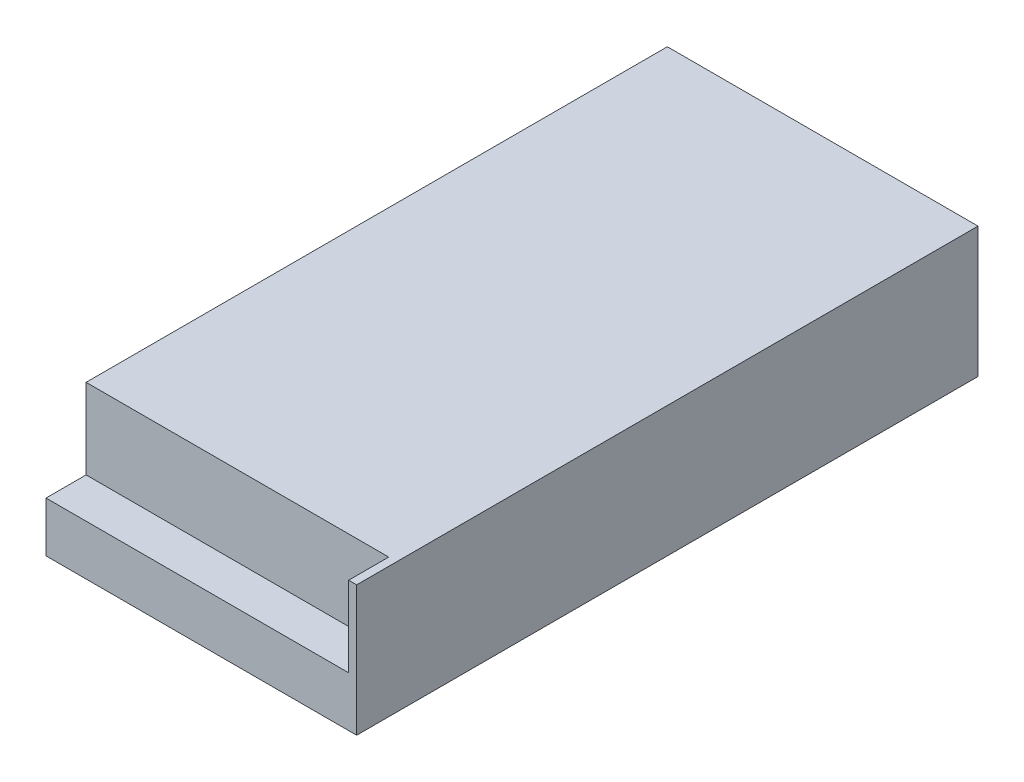
ISO-10303-21;
HEADER;
FILE_DESCRIPTION(('STEP AP214'),'2;1');
FILE_NAME('part.step','',(''),(''),'','','');
FILE_SCHEMA(('AUTOMOTIVE_DESIGN { 1 0 10303 214 1 1 1 1 }'));
ENDSEC;
DATA;
#1=APPLICATION_CONTEXT('core data for automotive mechanical design processes');
#2=APPLICATION_PROTOCOL_DEFINITION('international standard','automotive_design',2000,#1);
#3=PRODUCT_CONTEXT('',#1,'mechanical');
#4=PRODUCT('Part','Part','',(#3));
#5=PRODUCT_RELATED_PRODUCT_CATEGORY('part','',(#4));
#6=PRODUCT_DEFINITION_FORMATION('','',#4);
#7=PRODUCT_DEFINITION_CONTEXT('part definition',#1,'design');
#8=PRODUCT_DEFINITION('design','',#6,#7);
#9=PRODUCT_DEFINITION_SHAPE('','',#8);
#10=(LENGTH_UNIT() NAMED_UNIT(*) SI_UNIT(.MILLI.,.METRE.));
#11=(NAMED_UNIT(*) PLANE_ANGLE_UNIT() SI_UNIT($,.RADIAN.));
#12=(NAMED_UNIT(*) SI_UNIT($,.STERADIAN.) SOLID_ANGLE_UNIT());
#13=UNCERTAINTY_MEASURE_WITH_UNIT(LENGTH_MEASURE(1.E-05),#10,'distance_accuracy_value','');
#14=(GEOMETRIC_REPRESENTATION_CONTEXT(3) GLOBAL_UNCERTAINTY_ASSIGNED_CONTEXT((#13)) GLOBAL_UNIT_ASSIGNED_CONTEXT((#10,
#11,#12)) REPRESENTATION_CONTEXT('',''));
#15=CARTESIAN_POINT('',(0.,0.,0.));
#16=DIRECTION('',(0.,0.,1.));
#17=DIRECTION('',(1.,0.,0.));
#18=AXIS2_PLACEMENT_3D('',#15,#16,#17);
#19=CARTESIAN_POINT('',(0.,41.275,0.));
#20=DIRECTION('',(1.,0.,0.));
#21=DIRECTION('',(0.,0.,-1.));
#22=AXIS2_PLACEMENT_3D('',#19,#20,#21);
#23=PLANE('',#22);
#24=DIRECTION('',(0.,1.,0.));
#25=VECTOR('',#24,1.);
#26=CARTESIAN_POINT('',(0.,41.275,-12.7));
#27=LINE('',#26,#25);
#28=CARTESIAN_POINT('',(0.,15.875,-12.7));
#29=VERTEX_POINT('',#28);
#30=CARTESIAN_POINT('',(0.,41.275,-12.7));
#31=VERTEX_POINT('',#30);
#32=EDGE_CURVE('E120',#29,#31,#27,.T.);
#33=ORIENTED_EDGE('',*,*,#32,.T.);
#34=DIRECTION('',(0.,0.,1.));
#35=VECTOR('',#34,1.);
#36=CARTESIAN_POINT('',(0.,41.275,0.));
#37=LINE('',#36,#35);
#38=CARTESIAN_POINT('',(0.,41.275,-196.85));
#39=VERTEX_POINT('',#38);
#40=EDGE_CURVE('E150',#39,#31,#37,.T.);
#41=ORIENTED_EDGE('',*,*,#40,.F.);
#42=DIRECTION('',(0.,-1.,0.));
#43=VECTOR('',#42,1.);
#44=CARTESIAN_POINT('',(0.,41.275,-196.85));
#45=LINE('',#44,#43);
#46=CARTESIAN_POINT('',(0.,0.,-196.85));
#47=VERTEX_POINT('',#46);
#48=EDGE_CURVE('E132',#39,#47,#45,.T.);
#49=ORIENTED_EDGE('',*,*,#48,.T.);
#50=DIRECTION('',(0.,0.,1.));
#51=VECTOR('',#50,1.);
#52=CARTESIAN_POINT('',(0.,0.,0.));
#53=LINE('',#52,#51);
#54=CARTESIAN_POINT('',(0.,0.,0.));
#55=VERTEX_POINT('',#54);
#56=EDGE_CURVE('E130',#47,#55,#53,.T.);
#57=ORIENTED_EDGE('',*,*,#56,.T.);
#58=DIRECTION('',(0.,-1.,0.));
#59=VECTOR('',#58,1.);
#60=CARTESIAN_POINT('',(0.,41.275,0.));
#61=LINE('',#60,#59);
#62=CARTESIAN_POINT('',(0.,15.875,0.));
#63=VERTEX_POINT('',#62);
#64=EDGE_CURVE('E12',#63,#55,#61,.T.);
#65=ORIENTED_EDGE('',*,*,#64,.F.);
#66=DIRECTION('',(0.,0.,-1.));
#67=VECTOR('',#66,1.);
#68=CARTESIAN_POINT('',(0.,15.875,0.));
#69=LINE('',#68,#67);
#70=EDGE_CURVE('E109',#63,#29,#69,.T.);
#71=ORIENTED_EDGE('',*,*,#70,.T.);
#72=EDGE_LOOP('',(#33,#41,#49,#57,#65,#71));
#73=FACE_BOUND('',#72,.T.);
#74=ADVANCED_FACE('F41',(#73),#23,.F.);
#75=CARTESIAN_POINT('',(0.,41.275,0.));
#76=DIRECTION('',(0.,0.,-1.));
#77=DIRECTION('',(-1.,0.,0.));
#78=AXIS2_PLACEMENT_3D('',#75,#76,#77);
#79=PLANE('',#78);
#80=DIRECTION('',(-1.,0.,0.));
#81=VECTOR('',#80,1.);
#82=CARTESIAN_POINT('',(126.823063314247,15.875,0.));
#83=LINE('',#82,#81);
#84=CARTESIAN_POINT('',(95.885,15.875,0.));
#85=VERTEX_POINT('',#84);
#86=EDGE_CURVE('E112',#85,#63,#83,.T.);
#87=ORIENTED_EDGE('',*,*,#86,.T.);
#88=ORIENTED_EDGE('',*,*,#64,.T.);
#89=DIRECTION('',(1.,0.,0.));
#90=VECTOR('',#89,1.);
#91=CARTESIAN_POINT('',(0.,0.,0.));
#92=LINE('',#91,#90);
#93=CARTESIAN_POINT('',(98.425,0.,0.));
#94=VERTEX_POINT('',#93);
#95=EDGE_CURVE('E135',#55,#94,#92,.T.);
#96=ORIENTED_EDGE('',*,*,#95,.T.);
#97=DIRECTION('',(0.,-1.,0.));
#98=VECTOR('',#97,1.);
#99=CARTESIAN_POINT('',(98.425,41.275,0.));
#100=LINE('',#99,#98);
#101=CARTESIAN_POINT('',(98.425,41.275,0.));
#102=VERTEX_POINT('',#101);
#103=EDGE_CURVE('E49',#102,#94,#100,.T.);
#104=ORIENTED_EDGE('',*,*,#103,.F.);
#105=DIRECTION('',(1.,0.,0.));
#106=VECTOR('',#105,1.);
#107=CARTESIAN_POINT('',(0.,41.275,0.));
#108=LINE('',#107,#106);
#109=CARTESIAN_POINT('',(95.885,41.275,0.));
#110=VERTEX_POINT('',#109);
#111=EDGE_CURVE('E88',#110,#102,#108,.T.);
#112=ORIENTED_EDGE('',*,*,#111,.F.);
#113=DIRECTION('',(0.,1.,0.));
#114=VECTOR('',#113,1.);
#115=CARTESIAN_POINT('',(95.885,41.275,0.));
#116=LINE('',#115,#114);
#117=EDGE_CURVE('E56',#85,#110,#116,.T.);
#118=ORIENTED_EDGE('',*,*,#117,.F.);
#119=EDGE_LOOP('',(#87,#88,#96,#104,#112,#118));
#120=FACE_BOUND('',#119,.T.);
#121=ADVANCED_FACE('F123',(#120),#79,.F.);
#122=CARTESIAN_POINT('',(0.,41.275,0.));
#123=DIRECTION('',(0.,-1.,0.));
#124=DIRECTION('',(0.,0.,-1.));
#125=AXIS2_PLACEMENT_3D('',#122,#123,#124);
#126=PLANE('',#125);
#127=DIRECTION('',(-1.,0.,0.));
#128=VECTOR('',#127,1.);
#129=CARTESIAN_POINT('',(126.823063314247,41.275,-12.7));
#130=LINE('',#129,#128);
#131=CARTESIAN_POINT('',(95.885,41.275,-12.7));
#132=VERTEX_POINT('',#131);
#133=EDGE_CURVE('E246',#132,#31,#130,.T.);
#134=ORIENTED_EDGE('',*,*,#133,.F.);
#135=DIRECTION('',(0.,0.,-1.));
#136=VECTOR('',#135,1.);
#137=CARTESIAN_POINT('',(95.885,41.275,0.));
#138=LINE('',#137,#136);
#139=EDGE_CURVE('E126',#110,#132,#138,.T.);
#140=ORIENTED_EDGE('',*,*,#139,.F.);
#141=ORIENTED_EDGE('',*,*,#111,.T.);
#142=DIRECTION('',(0.,0.,-1.));
#143=VECTOR('',#142,1.);
#144=CARTESIAN_POINT('',(98.425,41.275,0.));
#145=LINE('',#144,#143);
#146=CARTESIAN_POINT('',(98.425,41.275,-196.85));
#147=VERTEX_POINT('',#146);
#148=EDGE_CURVE('E162',#102,#147,#145,.T.);
#149=ORIENTED_EDGE('',*,*,#148,.T.);
#150=DIRECTION('',(-1.,0.,0.));
#151=VECTOR('',#150,1.);
#152=CARTESIAN_POINT('',(0.,41.275,-196.85));
#153=LINE('',#152,#151);
#154=EDGE_CURVE('E65',#147,#39,#153,.T.);
#155=ORIENTED_EDGE('',*,*,#154,.T.);
#156=ORIENTED_EDGE('',*,*,#40,.T.);
#157=EDGE_LOOP('',(#134,#140,#141,#149,#155,#156));
#158=FACE_BOUND('',#157,.T.);
#159=ADVANCED_FACE('F180',(#158),#126,.F.);
#160=CARTESIAN_POINT('',(98.425,41.275,0.));
#161=DIRECTION('',(-1.,0.,0.));
#162=DIRECTION('',(0.,0.,1.));
#163=AXIS2_PLACEMENT_3D('',#160,#161,#162);
#164=PLANE('',#163);
#165=DIRECTION('',(0.,0.,-1.));
#166=VECTOR('',#165,1.);
#167=CARTESIAN_POINT('',(98.425,0.,0.));
#168=LINE('',#167,#166);
#169=CARTESIAN_POINT('',(98.425,0.,-196.85));
#170=VERTEX_POINT('',#169);
#171=EDGE_CURVE('E139',#94,#170,#168,.T.);
#172=ORIENTED_EDGE('',*,*,#171,.T.);
#173=DIRECTION('',(0.,-1.,0.));
#174=VECTOR('',#173,1.);
#175=CARTESIAN_POINT('',(98.425,41.275,-196.85));
#176=LINE('',#175,#174);
#177=EDGE_CURVE('E153',#147,#170,#176,.T.);
#178=ORIENTED_EDGE('',*,*,#177,.F.);
#179=ORIENTED_EDGE('',*,*,#148,.F.);
#180=ORIENTED_EDGE('',*,*,#103,.T.);
#181=EDGE_LOOP('',(#172,#178,#179,#180));
#182=FACE_BOUND('',#181,.T.);
#183=ADVANCED_FACE('F160',(#182),#164,.F.);
#184=CARTESIAN_POINT('',(0.,41.275,-196.85));
#185=DIRECTION('',(0.,0.,1.));
#186=DIRECTION('',(1.,0.,0.));
#187=AXIS2_PLACEMENT_3D('',#184,#185,#186);
#188=PLANE('',#187);
#189=DIRECTION('',(-1.,0.,0.));
#190=VECTOR('',#189,1.);
#191=CARTESIAN_POINT('',(0.,0.,-196.85));
#192=LINE('',#191,#190);
#193=EDGE_CURVE('E84',#170,#47,#192,.T.);
#194=ORIENTED_EDGE('',*,*,#193,.T.);
#195=ORIENTED_EDGE('',*,*,#48,.F.);
#196=ORIENTED_EDGE('',*,*,#154,.F.);
#197=ORIENTED_EDGE('',*,*,#177,.T.);
#198=EDGE_LOOP('',(#194,#195,#196,#197));
#199=FACE_BOUND('',#198,.T.);
#200=ADVANCED_FACE('F166',(#199),#188,.F.);
#201=CARTESIAN_POINT('',(0.,0.,0.));
#202=DIRECTION('',(0.,-1.,0.));
#203=DIRECTION('',(0.,0.,-1.));
#204=AXIS2_PLACEMENT_3D('',#201,#202,#203);
#205=PLANE('',#204);
#206=ORIENTED_EDGE('',*,*,#56,.F.);
#207=ORIENTED_EDGE('',*,*,#193,.F.);
#208=ORIENTED_EDGE('',*,*,#171,.F.);
#209=ORIENTED_EDGE('',*,*,#95,.F.);
#210=EDGE_LOOP('',(#206,#207,#208,#209));
#211=FACE_BOUND('',#210,.T.);
#212=ADVANCED_FACE('F163',(#211),#205,.T.);
#213=CARTESIAN_POINT('',(126.823063314247,41.275,-12.7));
#214=DIRECTION('',(0.,0.,1.));
#215=DIRECTION('',(0.,-1.,0.));
#216=AXIS2_PLACEMENT_3D('',#213,#214,#215);
#217=PLANE('',#216);
#218=ORIENTED_EDGE('',*,*,#133,.T.);
#219=ORIENTED_EDGE('',*,*,#32,.F.);
#220=DIRECTION('',(-1.,0.,0.));
#221=VECTOR('',#220,1.);
#222=CARTESIAN_POINT('',(126.823063314247,15.875,-12.7));
#223=LINE('',#222,#221);
#224=CARTESIAN_POINT('',(95.885,15.875,-12.7));
#225=VERTEX_POINT('',#224);
#226=EDGE_CURVE('E114',#225,#29,#223,.T.);
#227=ORIENTED_EDGE('',*,*,#226,.F.);
#228=DIRECTION('',(0.,-1.,0.));
#229=VECTOR('',#228,1.);
#230=CARTESIAN_POINT('',(95.885,41.275,-12.7));
#231=LINE('',#230,#229);
#232=EDGE_CURVE('E238',#132,#225,#231,.T.);
#233=ORIENTED_EDGE('',*,*,#232,.F.);
#234=EDGE_LOOP('',(#218,#219,#227,#233));
#235=FACE_BOUND('',#234,.T.);
#236=ADVANCED_FACE('F165',(#235),#217,.T.);
#237=CARTESIAN_POINT('',(126.823063314247,15.875,0.));
#238=DIRECTION('',(0.,1.,0.));
#239=DIRECTION('',(0.,0.,1.));
#240=AXIS2_PLACEMENT_3D('',#237,#238,#239);
#241=PLANE('',#240);
#242=ORIENTED_EDGE('',*,*,#226,.T.);
#243=ORIENTED_EDGE('',*,*,#70,.F.);
#244=ORIENTED_EDGE('',*,*,#86,.F.);
#245=DIRECTION('',(0.,0.,1.));
#246=VECTOR('',#245,1.);
#247=CARTESIAN_POINT('',(95.885,15.875,0.));
#248=LINE('',#247,#246);
#249=EDGE_CURVE('E141',#225,#85,#248,.T.);
#250=ORIENTED_EDGE('',*,*,#249,.F.);
#251=EDGE_LOOP('',(#242,#243,#244,#250));
#252=FACE_BOUND('',#251,.T.);
#253=ADVANCED_FACE('F111',(#252),#241,.T.);
#254=CARTESIAN_POINT('',(95.885,41.275,0.));
#255=DIRECTION('',(-1.,0.,0.));
#256=DIRECTION('',(0.,0.,1.));
#257=AXIS2_PLACEMENT_3D('',#254,#255,#256);
#258=PLANE('',#257);
#259=ORIENTED_EDGE('',*,*,#249,.T.);
#260=ORIENTED_EDGE('',*,*,#117,.T.);
#261=ORIENTED_EDGE('',*,*,#139,.T.);
#262=ORIENTED_EDGE('',*,*,#232,.T.);
#263=EDGE_LOOP('',(#259,#260,#261,#262));
#264=FACE_BOUND('',#263,.T.);
#265=ADVANCED_FACE('F225',(#264),#258,.T.);
#266=CLOSED_SHELL('',(#74,#121,#159,#183,#200,#212,#236,#253,#265));
#267=MANIFOLD_SOLID_BREP('B2',#266);
#268=ADVANCED_BREP_SHAPE_REPRESENTATION('',(#18,#267),#14);
#269=SHAPE_DEFINITION_REPRESENTATION(#9,#268);
ENDSEC;
END-ISO-10303-21;
